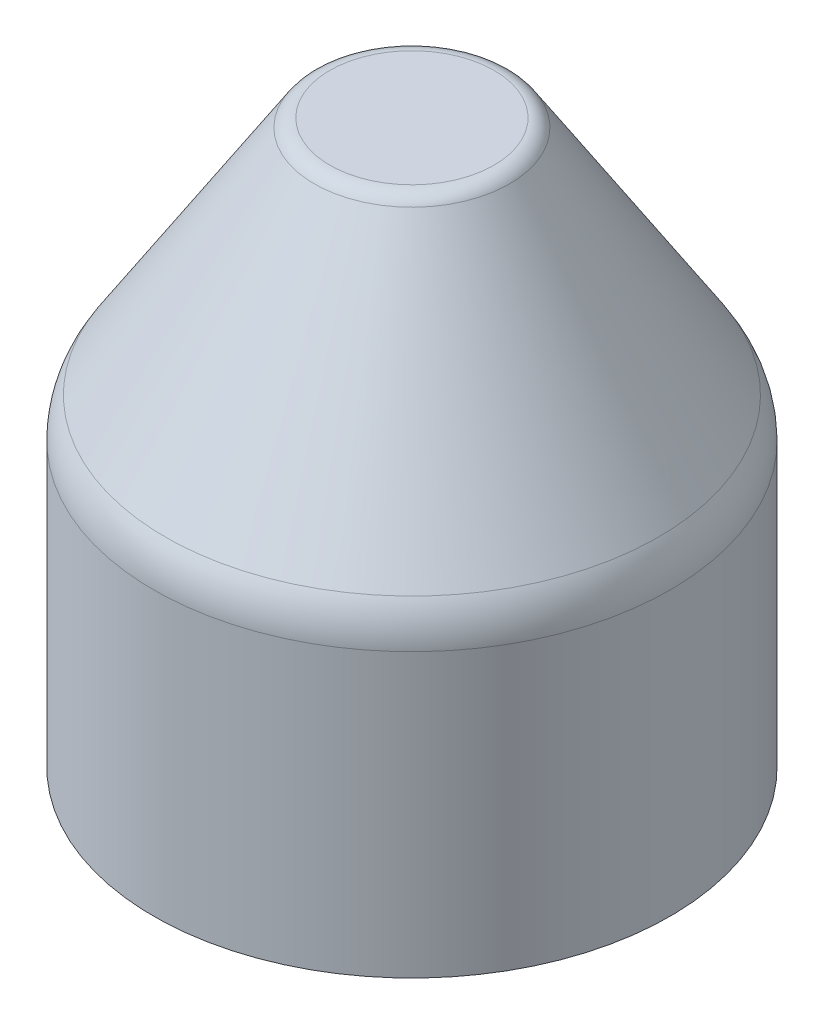
ISO-10303-21;
HEADER;
FILE_DESCRIPTION(('STEP AP214'),'2;1');
FILE_NAME('part.step','',(''),(''),'','','');
FILE_SCHEMA(('AUTOMOTIVE_DESIGN { 1 0 10303 214 1 1 1 1 }'));
ENDSEC;
DATA;
#1=APPLICATION_CONTEXT('core data for automotive mechanical design processes');
#2=APPLICATION_PROTOCOL_DEFINITION('international standard','automotive_design',2000,#1);
#3=PRODUCT_CONTEXT('',#1,'mechanical');
#4=PRODUCT('Part','Part','',(#3));
#5=PRODUCT_RELATED_PRODUCT_CATEGORY('part','',(#4));
#6=PRODUCT_DEFINITION_FORMATION('','',#4);
#7=PRODUCT_DEFINITION_CONTEXT('part definition',#1,'design');
#8=PRODUCT_DEFINITION('design','',#6,#7);
#9=PRODUCT_DEFINITION_SHAPE('','',#8);
#10=(LENGTH_UNIT() NAMED_UNIT(*) SI_UNIT(.MILLI.,.METRE.));
#11=(NAMED_UNIT(*) PLANE_ANGLE_UNIT() SI_UNIT($,.RADIAN.));
#12=(NAMED_UNIT(*) SI_UNIT($,.STERADIAN.) SOLID_ANGLE_UNIT());
#13=UNCERTAINTY_MEASURE_WITH_UNIT(LENGTH_MEASURE(1.E-05),#10,'distance_accuracy_value','');
#14=(GEOMETRIC_REPRESENTATION_CONTEXT(3) GLOBAL_UNCERTAINTY_ASSIGNED_CONTEXT((#13)) GLOBAL_UNIT_ASSIGNED_CONTEXT((#10,
#11,#12)) REPRESENTATION_CONTEXT('',''));
#15=CARTESIAN_POINT('',(0.,0.,0.));
#16=DIRECTION('',(0.,0.,1.));
#17=DIRECTION('',(1.,0.,0.));
#18=AXIS2_PLACEMENT_3D('',#15,#16,#17);
#19=CARTESIAN_POINT('',(-7.21644966006352E-13,32.000000000001,-1.11022302462516E-13));
#20=DIRECTION('',(0.,1.,0.));
#21=DIRECTION('',(0.,0.,0.999999999999997));
#22=AXIS2_PLACEMENT_3D('',#19,#20,#21);
#23=PLANE('',#22);
#24=CARTESIAN_POINT('',(-7.21644966006352E-13,32.000000000001,-1.11022302462516E-13));
#25=DIRECTION('',(0.,-1.,0.));
#26=DIRECTION('',(0.,0.,-0.999999999999997));
#27=AXIS2_PLACEMENT_3D('',#24,#25,#26);
#28=CIRCLE('',#27,4.45404878735049);
#29=CARTESIAN_POINT('',(-7.23870210388786E-13,32.000000000001,-4.45404878735058));
#30=VERTEX_POINT('',#29);
#31=EDGE_CURVE('E10',#30,#30,#28,.T.);
#32=ORIENTED_EDGE('',*,*,#31,.F.);
#33=EDGE_LOOP('',(#32));
#34=FACE_BOUND('',#33,.T.);
#35=ADVANCED_FACE('F41',(#34),#23,.T.);
#36=CARTESIAN_POINT('',(-1.11022302462516E-13,31.000000000001,2.22044604925031E-13));
#37=DIRECTION('',(0.,-1.,0.));
#38=DIRECTION('',(0.,0.,-0.999999999999997));
#39=AXIS2_PLACEMENT_3D('',#36,#37,#38);
#40=TOROIDAL_SURFACE('',#39,4.45404878735049,1.00000000000001);
#41=ORIENTED_EDGE('',*,*,#31,.T.);
#42=EDGE_LOOP('',(#41));
#43=FACE_BOUND('',#42,.T.);
#44=CARTESIAN_POINT('',(-5.55111512312578E-13,31.5407575913143,-1.11022302462516E-13));
#45=DIRECTION('',(0.,-1.,0.));
#46=DIRECTION('',(0.,0.,-0.999999999999997));
#47=AXIS2_PLACEMENT_3D('',#44,#45,#46);
#48=CIRCLE('',#47,5.29522726272704);
#49=CARTESIAN_POINT('',(-5.57757009765044E-13,31.5407575913143,-5.29522726272714));
#50=VERTEX_POINT('',#49);
#51=EDGE_CURVE('E48',#50,#50,#48,.T.);
#52=ORIENTED_EDGE('',*,*,#51,.F.);
#53=EDGE_LOOP('',(#52));
#54=FACE_BOUND('',#53,.T.);
#55=ADVANCED_FACE('F108',(#43,#54),#40,.T.);
#56=CARTESIAN_POINT('',(-6.10622663543836E-13,18.9882228198797,-1.11022302462516E-13));
#57=DIRECTION('',(0.,-1.,0.));
#58=DIRECTION('',(0.,0.,-0.999999999999997));
#59=AXIS2_PLACEMENT_3D('',#56,#57,#58);
#60=CONICAL_SURFACE('',#59,13.3647139015062,0.571337479833626);
#61=ORIENTED_EDGE('',*,*,#51,.T.);
#62=EDGE_LOOP('',(#61));
#63=FACE_BOUND('',#62,.T.);
#64=CARTESIAN_POINT('',(-6.10622663543836E-13,18.9882228198797,-1.11022302462516E-13));
#65=DIRECTION('',(0.,-1.,0.));
#66=DIRECTION('',(0.,0.,-0.999999999999997));
#67=AXIS2_PLACEMENT_3D('',#64,#65,#66);
#68=CIRCLE('',#67,13.3647139015062);
#69=CARTESIAN_POINT('',(-6.17299679434777E-13,18.9882228198797,-13.3647139015063));
#70=VERTEX_POINT('',#69);
#71=EDGE_CURVE('E54',#70,#70,#68,.T.);
#72=ORIENTED_EDGE('',*,*,#71,.F.);
#73=EDGE_LOOP('',(#72));
#74=FACE_BOUND('',#73,.T.);
#75=ADVANCED_FACE('F113',(#63,#74),#60,.T.);
#76=CARTESIAN_POINT('',(-4.9960036108132E-13,16.8251924546264,-5.55111512312578E-13));
#77=DIRECTION('',(0.,-1.,0.));
#78=DIRECTION('',(0.,0.,-0.999999999999997));
#79=AXIS2_PLACEMENT_3D('',#76,#77,#78);
#80=TOROIDAL_SURFACE('',#79,10.,4.);
#81=ORIENTED_EDGE('',*,*,#71,.T.);
#82=EDGE_LOOP('',(#81));
#83=FACE_BOUND('',#82,.T.);
#84=CARTESIAN_POINT('',(-4.9960036108132E-13,16.8251924546264,-5.55111512312578E-13));
#85=DIRECTION('',(0.,-1.,0.));
#86=DIRECTION('',(0.,0.,-0.999999999999997));
#87=AXIS2_PLACEMENT_3D('',#84,#85,#86);
#88=CIRCLE('',#87,14.);
#89=CARTESIAN_POINT('',(-5.06594766136459E-13,16.8251924546264,-14.0000000000005));
#90=VERTEX_POINT('',#89);
#91=EDGE_CURVE('E60',#90,#90,#88,.T.);
#92=ORIENTED_EDGE('',*,*,#91,.F.);
#93=EDGE_LOOP('',(#92));
#94=FACE_BOUND('',#93,.T.);
#95=ADVANCED_FACE('F117',(#83,#94),#80,.T.);
#96=CARTESIAN_POINT('',(0.,0.,0.));
#97=DIRECTION('',(0.,-1.,0.));
#98=DIRECTION('',(0.,0.,-0.999999999999997));
#99=AXIS2_PLACEMENT_3D('',#96,#97,#98);
#100=CYLINDRICAL_SURFACE('',#99,14.);
#101=ORIENTED_EDGE('',*,*,#91,.T.);
#102=EDGE_LOOP('',(#101));
#103=FACE_BOUND('',#102,.T.);
#104=CARTESIAN_POINT('',(0.,1.50000000000186,1.11022302462516E-13));
#105=DIRECTION('',(0.,-1.,0.));
#106=DIRECTION('',(0.,0.,-0.999999999999997));
#107=AXIS2_PLACEMENT_3D('',#104,#105,#106);
#108=CIRCLE('',#107,14.);
#109=CARTESIAN_POINT('',(0.,1.50000000000187,-13.9999999999998));
#110=VERTEX_POINT('',#109);
#111=EDGE_CURVE('E66',#110,#110,#108,.T.);
#112=ORIENTED_EDGE('',*,*,#111,.F.);
#113=EDGE_LOOP('',(#112));
#114=FACE_BOUND('',#113,.T.);
#115=ADVANCED_FACE('F123',(#103,#114),#100,.T.);
#116=CARTESIAN_POINT('',(0.,0.,0.));
#117=DIRECTION('',(0.,1.,0.));
#118=DIRECTION('',(0.,0.,0.999999999999997));
#119=AXIS2_PLACEMENT_3D('',#116,#117,#118);
#120=CONICAL_SURFACE('',#119,10.75,1.13838855122436);
#121=ORIENTED_EDGE('',*,*,#111,.T.);
#122=EDGE_LOOP('',(#121));
#123=FACE_BOUND('',#122,.T.);
#124=CARTESIAN_POINT('',(0.,0.,0.));
#125=DIRECTION('',(0.,-1.,0.));
#126=DIRECTION('',(0.,0.,-0.999999999999997));
#127=AXIS2_PLACEMENT_3D('',#124,#125,#126);
#128=CIRCLE('',#127,10.75);
#129=CARTESIAN_POINT('',(0.,0.,-10.75));
#130=VERTEX_POINT('',#129);
#131=EDGE_CURVE('E70',#130,#130,#128,.T.);
#132=ORIENTED_EDGE('',*,*,#131,.F.);
#133=EDGE_LOOP('',(#132));
#134=FACE_BOUND('',#133,.T.);
#135=ADVANCED_FACE('F127',(#123,#134),#120,.T.);
#136=CARTESIAN_POINT('',(10.75,9.43689570931383E-13,3.33066907387547E-13));
#137=DIRECTION('',(0.,-1.,0.));
#138=DIRECTION('',(0.,0.,-0.999999999999997));
#139=AXIS2_PLACEMENT_3D('',#136,#137,#138);
#140=PLANE('',#139);
#141=ORIENTED_EDGE('',*,*,#131,.T.);
#142=EDGE_LOOP('',(#141));
#143=FACE_BOUND('',#142,.T.);
#144=CARTESIAN_POINT('',(0.,0.,0.));
#145=DIRECTION('',(0.,-1.,0.));
#146=DIRECTION('',(0.,0.,-0.999999999999997));
#147=AXIS2_PLACEMENT_3D('',#144,#145,#146);
#148=CIRCLE('',#147,10.);
#149=CARTESIAN_POINT('',(0.,0.,-9.99999999999997));
#150=VERTEX_POINT('',#149);
#151=EDGE_CURVE('E74',#150,#150,#148,.T.);
#152=ORIENTED_EDGE('',*,*,#151,.F.);
#153=EDGE_LOOP('',(#152));
#154=FACE_BOUND('',#153,.T.);
#155=ADVANCED_FACE('F131',(#143,#154),#140,.T.);
#156=CARTESIAN_POINT('',(0.,0.,0.));
#157=DIRECTION('',(0.,-1.,0.));
#158=DIRECTION('',(0.,0.,-0.999999999999997));
#159=AXIS2_PLACEMENT_3D('',#156,#157,#158);
#160=CYLINDRICAL_SURFACE('',#159,10.);
#161=ORIENTED_EDGE('',*,*,#151,.T.);
#162=EDGE_LOOP('',(#161));
#163=FACE_BOUND('',#162,.T.);
#164=CARTESIAN_POINT('',(0.,16.000000000001,0.));
#165=DIRECTION('',(0.,-1.,0.));
#166=DIRECTION('',(0.,0.,-0.999999999999997));
#167=AXIS2_PLACEMENT_3D('',#164,#165,#166);
#168=CIRCLE('',#167,10.);
#169=CARTESIAN_POINT('',(0.,16.000000000001,-9.99999999999997));
#170=VERTEX_POINT('',#169);
#171=EDGE_CURVE('E78',#170,#170,#168,.T.);
#172=ORIENTED_EDGE('',*,*,#171,.F.);
#173=EDGE_LOOP('',(#172));
#174=FACE_BOUND('',#173,.T.);
#175=ADVANCED_FACE('F104',(#163,#174),#160,.F.);
#176=CARTESIAN_POINT('',(3.7999999999998,16.0000000000013,-1.11022302462516E-13));
#177=DIRECTION('',(0.,-1.,0.));
#178=DIRECTION('',(0.,0.,-0.999999999999997));
#179=AXIS2_PLACEMENT_3D('',#176,#177,#178);
#180=PLANE('',#179);
#181=ORIENTED_EDGE('',*,*,#171,.T.);
#182=EDGE_LOOP('',(#181));
#183=FACE_BOUND('',#182,.T.);
#184=CARTESIAN_POINT('',(0.,16.000000000001,0.));
#185=DIRECTION('',(0.,-1.,0.));
#186=DIRECTION('',(0.,0.,-0.999999999999997));
#187=AXIS2_PLACEMENT_3D('',#184,#185,#186);
#188=CIRCLE('',#187,3.8);
#189=CARTESIAN_POINT('',(0.,16.000000000001,-3.79999999999999));
#190=VERTEX_POINT('',#189);
#191=EDGE_CURVE('E82',#190,#190,#188,.T.);
#192=ORIENTED_EDGE('',*,*,#191,.F.);
#193=EDGE_LOOP('',(#192));
#194=FACE_BOUND('',#193,.T.);
#195=ADVANCED_FACE('F96',(#183,#194),#180,.T.);
#196=CARTESIAN_POINT('',(0.,0.,0.));
#197=DIRECTION('',(0.,-1.,0.));
#198=DIRECTION('',(0.,0.,-0.999999999999997));
#199=AXIS2_PLACEMENT_3D('',#196,#197,#198);
#200=CYLINDRICAL_SURFACE('',#199,3.8);
#201=ORIENTED_EDGE('',*,*,#191,.T.);
#202=EDGE_LOOP('',(#201));
#203=FACE_BOUND('',#202,.T.);
#204=CARTESIAN_POINT('',(-3.33066907387547E-13,30.0000000000003,-1.11022302462516E-13));
#205=DIRECTION('',(0.,-1.,0.));
#206=DIRECTION('',(0.,0.,-0.999999999999997));
#207=AXIS2_PLACEMENT_3D('',#204,#205,#206);
#208=CIRCLE('',#207,3.8);
#209=CARTESIAN_POINT('',(-3.34965388759656E-13,30.0000000000003,-3.8000000000001));
#210=VERTEX_POINT('',#209);
#211=EDGE_CURVE('E86',#210,#210,#208,.T.);
#212=ORIENTED_EDGE('',*,*,#211,.F.);
#213=EDGE_LOOP('',(#212));
#214=FACE_BOUND('',#213,.T.);
#215=ADVANCED_FACE('F94',(#203,#214),#200,.F.);
#216=CARTESIAN_POINT('',(3.79999999999975,30.0000000000002,1.11022302462516E-13));
#217=DIRECTION('',(0.,-1.,0.));
#218=DIRECTION('',(0.,0.,-0.999999999999997));
#219=AXIS2_PLACEMENT_3D('',#216,#217,#218);
#220=PLANE('',#219);
#221=ORIENTED_EDGE('',*,*,#211,.T.);
#222=EDGE_LOOP('',(#221));
#223=FACE_BOUND('',#222,.T.);
#224=ADVANCED_FACE('F92',(#223),#220,.T.);
#225=CLOSED_SHELL('',(#35,#55,#75,#95,#115,#135,#155,#175,#195,#215,#224));
#226=MANIFOLD_SOLID_BREP('B2',#225);
#227=ADVANCED_BREP_SHAPE_REPRESENTATION('',(#18,#226),#14);
#228=SHAPE_DEFINITION_REPRESENTATION(#9,#227);
ENDSEC;
END-ISO-10303-21;
